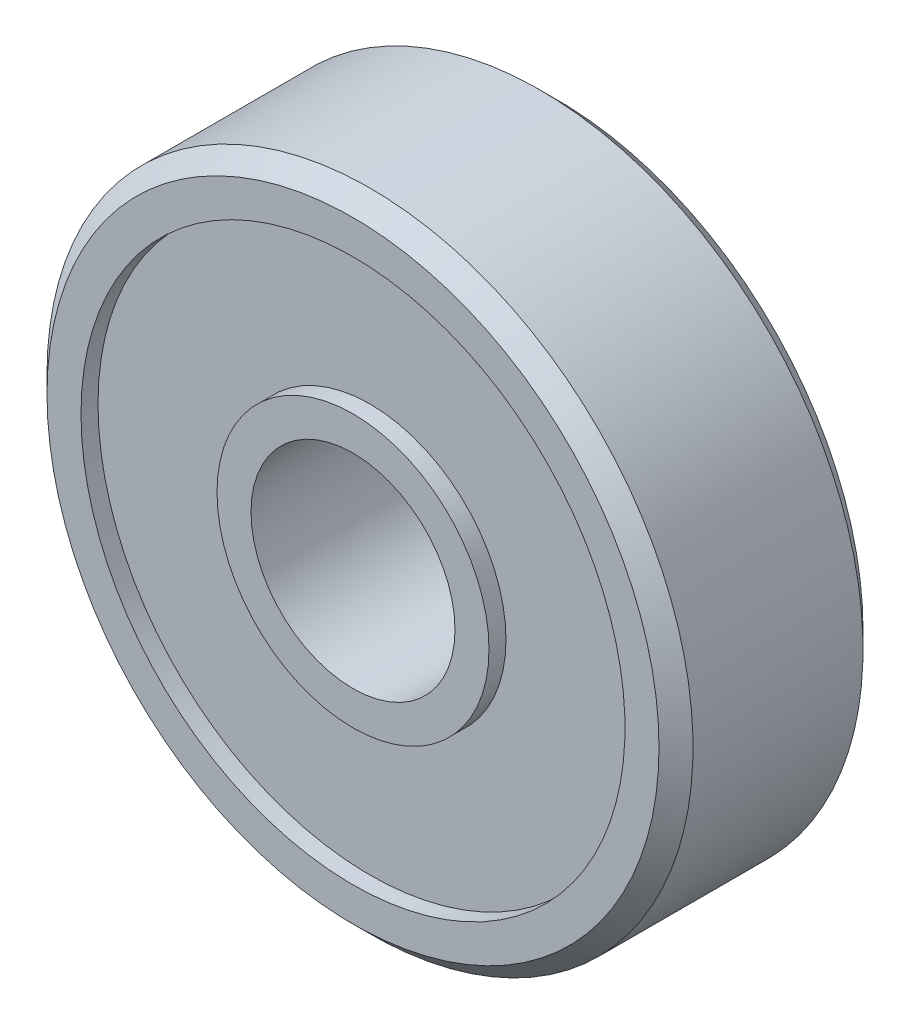
ISO-10303-21;
HEADER;
FILE_DESCRIPTION(('STEP AP214'),'2;1');
FILE_NAME('part.step','',(''),(''),'','','');
FILE_SCHEMA(('AUTOMOTIVE_DESIGN { 1 0 10303 214 1 1 1 1 }'));
ENDSEC;
DATA;
#1=APPLICATION_CONTEXT('core data for automotive mechanical design processes');
#2=APPLICATION_PROTOCOL_DEFINITION('international standard','automotive_design',2000,#1);
#3=PRODUCT_CONTEXT('',#1,'mechanical');
#4=PRODUCT('Part','Part','',(#3));
#5=PRODUCT_RELATED_PRODUCT_CATEGORY('part','',(#4));
#6=PRODUCT_DEFINITION_FORMATION('','',#4);
#7=PRODUCT_DEFINITION_CONTEXT('part definition',#1,'design');
#8=PRODUCT_DEFINITION('design','',#6,#7);
#9=PRODUCT_DEFINITION_SHAPE('','',#8);
#10=(LENGTH_UNIT() NAMED_UNIT(*) SI_UNIT(.MILLI.,.METRE.));
#11=(NAMED_UNIT(*) PLANE_ANGLE_UNIT() SI_UNIT($,.RADIAN.));
#12=(NAMED_UNIT(*) SI_UNIT($,.STERADIAN.) SOLID_ANGLE_UNIT());
#13=UNCERTAINTY_MEASURE_WITH_UNIT(LENGTH_MEASURE(1.E-05),#10,'distance_accuracy_value','');
#14=(GEOMETRIC_REPRESENTATION_CONTEXT(3) GLOBAL_UNCERTAINTY_ASSIGNED_CONTEXT((#13)) GLOBAL_UNIT_ASSIGNED_CONTEXT((#10,
#11,#12)) REPRESENTATION_CONTEXT('',''));
#15=CARTESIAN_POINT('',(0.,0.,0.));
#16=DIRECTION('',(0.,0.,1.));
#17=DIRECTION('',(1.,0.,0.));
#18=AXIS2_PLACEMENT_3D('',#15,#16,#17);
#19=CARTESIAN_POINT('',(0.,0.,0.500000000000005));
#20=DIRECTION('',(0.,0.,-1.));
#21=DIRECTION('',(-1.,0.,0.));
#22=AXIS2_PLACEMENT_3D('',#19,#20,#21);
#23=CYLINDRICAL_SURFACE('',#22,9.5);
#24=CARTESIAN_POINT('',(0.,0.,1.));
#25=DIRECTION('',(0.,0.,-1.));
#26=DIRECTION('',(-1.,0.,0.));
#27=AXIS2_PLACEMENT_3D('',#24,#25,#26);
#28=CIRCLE('',#27,9.5);
#29=CARTESIAN_POINT('',(-9.5,0.,0.999999999999997));
#30=VERTEX_POINT('',#29);
#31=EDGE_CURVE('E10',#30,#30,#28,.T.);
#32=ORIENTED_EDGE('',*,*,#31,.T.);
#33=EDGE_LOOP('',(#32));
#34=FACE_BOUND('',#33,.T.);
#35=CARTESIAN_POINT('',(0.,0.,-4.));
#36=DIRECTION('',(0.,0.,-1.));
#37=DIRECTION('',(-1.,0.,0.));
#38=AXIS2_PLACEMENT_3D('',#35,#36,#37);
#39=CIRCLE('',#38,9.5);
#40=CARTESIAN_POINT('',(-9.49999999999999,0.,-4.));
#41=VERTEX_POINT('',#40);
#42=EDGE_CURVE('E76',#41,#41,#39,.T.);
#43=ORIENTED_EDGE('',*,*,#42,.F.);
#44=EDGE_LOOP('',(#43));
#45=FACE_BOUND('',#44,.T.);
#46=ADVANCED_FACE('F30',(#34,#45),#23,.T.);
#47=CARTESIAN_POINT('',(0.,0.,1.));
#48=DIRECTION('',(0.,0.,-1.));
#49=DIRECTION('',(-1.,0.,0.));
#50=AXIS2_PLACEMENT_3D('',#47,#48,#49);
#51=CONICAL_SURFACE('',#50,9.5,0.785398163397458);
#52=CARTESIAN_POINT('',(0.,0.,1.5));
#53=DIRECTION('',(0.,0.,-1.));
#54=DIRECTION('',(-1.,0.,0.));
#55=AXIS2_PLACEMENT_3D('',#52,#53,#54);
#56=CIRCLE('',#55,8.99999999999999);
#57=CARTESIAN_POINT('',(-8.99999999999999,0.,1.5));
#58=VERTEX_POINT('',#57);
#59=EDGE_CURVE('E36',#58,#58,#56,.T.);
#60=ORIENTED_EDGE('',*,*,#59,.T.);
#61=EDGE_LOOP('',(#60));
#62=FACE_BOUND('',#61,.T.);
#63=ORIENTED_EDGE('',*,*,#31,.F.);
#64=EDGE_LOOP('',(#63));
#65=FACE_BOUND('',#64,.T.);
#66=ADVANCED_FACE('F84',(#62,#65),#51,.T.);
#67=CARTESIAN_POINT('',(8.99999999999999,0.,1.5));
#68=DIRECTION('',(0.,0.,1.));
#69=DIRECTION('',(1.,0.,0.));
#70=AXIS2_PLACEMENT_3D('',#67,#68,#69);
#71=PLANE('',#70);
#72=CARTESIAN_POINT('',(0.,0.,1.5));
#73=DIRECTION('',(0.,0.,-1.));
#74=DIRECTION('',(-1.,0.,0.));
#75=AXIS2_PLACEMENT_3D('',#72,#73,#74);
#76=CIRCLE('',#75,8.);
#77=CARTESIAN_POINT('',(-8.,0.,1.5));
#78=VERTEX_POINT('',#77);
#79=EDGE_CURVE('E40',#78,#78,#76,.T.);
#80=ORIENTED_EDGE('',*,*,#79,.T.);
#81=EDGE_LOOP('',(#80));
#82=FACE_BOUND('',#81,.T.);
#83=ORIENTED_EDGE('',*,*,#59,.F.);
#84=EDGE_LOOP('',(#83));
#85=FACE_BOUND('',#84,.T.);
#86=ADVANCED_FACE('F88',(#82,#85),#71,.T.);
#87=CARTESIAN_POINT('',(0.,0.,0.500000000000005));
#88=DIRECTION('',(0.,0.,-1.));
#89=DIRECTION('',(-1.,0.,0.));
#90=AXIS2_PLACEMENT_3D('',#87,#88,#89);
#91=CYLINDRICAL_SURFACE('',#90,8.);
#92=CARTESIAN_POINT('',(0.,0.,0.999999999999999));
#93=DIRECTION('',(0.,0.,-1.));
#94=DIRECTION('',(-1.,0.,0.));
#95=AXIS2_PLACEMENT_3D('',#92,#93,#94);
#96=CIRCLE('',#95,8.);
#97=CARTESIAN_POINT('',(-8.,0.,0.999999999999997));
#98=VERTEX_POINT('',#97);
#99=EDGE_CURVE('E44',#98,#98,#96,.T.);
#100=ORIENTED_EDGE('',*,*,#99,.T.);
#101=EDGE_LOOP('',(#100));
#102=FACE_BOUND('',#101,.T.);
#103=ORIENTED_EDGE('',*,*,#79,.F.);
#104=EDGE_LOOP('',(#103));
#105=FACE_BOUND('',#104,.T.);
#106=ADVANCED_FACE('F92',(#102,#105),#91,.F.);
#107=CARTESIAN_POINT('',(8.,0.,1.));
#108=DIRECTION('',(0.,0.,1.));
#109=DIRECTION('',(1.,0.,0.));
#110=AXIS2_PLACEMENT_3D('',#107,#108,#109);
#111=PLANE('',#110);
#112=CARTESIAN_POINT('',(0.,0.,1.));
#113=DIRECTION('',(0.,0.,-1.));
#114=DIRECTION('',(-1.,0.,0.));
#115=AXIS2_PLACEMENT_3D('',#112,#113,#114);
#116=CIRCLE('',#115,4.);
#117=CARTESIAN_POINT('',(-4.,0.,0.999999999999999));
#118=VERTEX_POINT('',#117);
#119=EDGE_CURVE('E49',#118,#118,#116,.T.);
#120=ORIENTED_EDGE('',*,*,#119,.T.);
#121=EDGE_LOOP('',(#120));
#122=FACE_BOUND('',#121,.T.);
#123=ORIENTED_EDGE('',*,*,#99,.F.);
#124=EDGE_LOOP('',(#123));
#125=FACE_BOUND('',#124,.T.);
#126=ADVANCED_FACE('F99',(#122,#125),#111,.T.);
#127=CARTESIAN_POINT('',(0.,0.,0.500000000000005));
#128=DIRECTION('',(0.,0.,-1.));
#129=DIRECTION('',(-1.,0.,0.));
#130=AXIS2_PLACEMENT_3D('',#127,#128,#129);
#131=CYLINDRICAL_SURFACE('',#130,4.);
#132=CARTESIAN_POINT('',(0.,0.,1.5));
#133=DIRECTION('',(0.,0.,-1.));
#134=DIRECTION('',(-1.,0.,0.));
#135=AXIS2_PLACEMENT_3D('',#132,#133,#134);
#136=CIRCLE('',#135,4.);
#137=CARTESIAN_POINT('',(-4.,0.,1.5));
#138=VERTEX_POINT('',#137);
#139=EDGE_CURVE('E52',#138,#138,#136,.T.);
#140=ORIENTED_EDGE('',*,*,#139,.T.);
#141=EDGE_LOOP('',(#140));
#142=FACE_BOUND('',#141,.T.);
#143=ORIENTED_EDGE('',*,*,#119,.F.);
#144=EDGE_LOOP('',(#143));
#145=FACE_BOUND('',#144,.T.);
#146=ADVANCED_FACE('F103',(#142,#145),#131,.T.);
#147=CARTESIAN_POINT('',(4.,0.,1.5));
#148=DIRECTION('',(0.,0.,1.));
#149=DIRECTION('',(1.,0.,0.));
#150=AXIS2_PLACEMENT_3D('',#147,#148,#149);
#151=PLANE('',#150);
#152=CARTESIAN_POINT('',(0.,0.,1.5));
#153=DIRECTION('',(0.,0.,-1.));
#154=DIRECTION('',(-1.,0.,0.));
#155=AXIS2_PLACEMENT_3D('',#152,#153,#154);
#156=CIRCLE('',#155,3.);
#157=CARTESIAN_POINT('',(-3.,0.,1.5));
#158=VERTEX_POINT('',#157);
#159=EDGE_CURVE('E55',#158,#158,#156,.T.);
#160=ORIENTED_EDGE('',*,*,#159,.T.);
#161=EDGE_LOOP('',(#160));
#162=FACE_BOUND('',#161,.T.);
#163=ORIENTED_EDGE('',*,*,#139,.F.);
#164=EDGE_LOOP('',(#163));
#165=FACE_BOUND('',#164,.T.);
#166=ADVANCED_FACE('F107',(#162,#165),#151,.T.);
#167=CARTESIAN_POINT('',(0.,0.,0.500000000000005));
#168=DIRECTION('',(0.,0.,-1.));
#169=DIRECTION('',(-1.,0.,0.));
#170=AXIS2_PLACEMENT_3D('',#167,#168,#169);
#171=CYLINDRICAL_SURFACE('',#170,3.);
#172=CARTESIAN_POINT('',(0.,0.,-4.5));
#173=DIRECTION('',(0.,0.,-1.));
#174=DIRECTION('',(-1.,0.,0.));
#175=AXIS2_PLACEMENT_3D('',#172,#173,#174);
#176=CIRCLE('',#175,3.);
#177=CARTESIAN_POINT('',(-2.99999999999999,0.,-4.5));
#178=VERTEX_POINT('',#177);
#179=EDGE_CURVE('E58',#178,#178,#176,.T.);
#180=ORIENTED_EDGE('',*,*,#179,.T.);
#181=EDGE_LOOP('',(#180));
#182=FACE_BOUND('',#181,.T.);
#183=ORIENTED_EDGE('',*,*,#159,.F.);
#184=EDGE_LOOP('',(#183));
#185=FACE_BOUND('',#184,.T.);
#186=ADVANCED_FACE('F111',(#182,#185),#171,.F.);
#187=CARTESIAN_POINT('',(3.,0.,-4.5));
#188=DIRECTION('',(0.,0.,-1.));
#189=DIRECTION('',(-1.,0.,0.));
#190=AXIS2_PLACEMENT_3D('',#187,#188,#189);
#191=PLANE('',#190);
#192=CARTESIAN_POINT('',(0.,0.,-4.5));
#193=DIRECTION('',(0.,0.,-1.));
#194=DIRECTION('',(-1.,0.,0.));
#195=AXIS2_PLACEMENT_3D('',#192,#193,#194);
#196=CIRCLE('',#195,4.);
#197=CARTESIAN_POINT('',(-3.99999999999999,0.,-4.5));
#198=VERTEX_POINT('',#197);
#199=EDGE_CURVE('E61',#198,#198,#196,.T.);
#200=ORIENTED_EDGE('',*,*,#199,.T.);
#201=EDGE_LOOP('',(#200));
#202=FACE_BOUND('',#201,.T.);
#203=ORIENTED_EDGE('',*,*,#179,.F.);
#204=EDGE_LOOP('',(#203));
#205=FACE_BOUND('',#204,.T.);
#206=ADVANCED_FACE('F115',(#202,#205),#191,.T.);
#207=CARTESIAN_POINT('',(0.,0.,0.500000000000005));
#208=DIRECTION('',(0.,0.,-1.));
#209=DIRECTION('',(-1.,0.,0.));
#210=AXIS2_PLACEMENT_3D('',#207,#208,#209);
#211=CYLINDRICAL_SURFACE('',#210,4.);
#212=CARTESIAN_POINT('',(0.,0.,-4.));
#213=DIRECTION('',(0.,0.,-1.));
#214=DIRECTION('',(-1.,0.,0.));
#215=AXIS2_PLACEMENT_3D('',#212,#213,#214);
#216=CIRCLE('',#215,4.);
#217=CARTESIAN_POINT('',(-3.99999999999999,0.,-4.));
#218=VERTEX_POINT('',#217);
#219=EDGE_CURVE('E64',#218,#218,#216,.T.);
#220=ORIENTED_EDGE('',*,*,#219,.T.);
#221=EDGE_LOOP('',(#220));
#222=FACE_BOUND('',#221,.T.);
#223=ORIENTED_EDGE('',*,*,#199,.F.);
#224=EDGE_LOOP('',(#223));
#225=FACE_BOUND('',#224,.T.);
#226=ADVANCED_FACE('F119',(#222,#225),#211,.T.);
#227=CARTESIAN_POINT('',(4.,0.,-4.));
#228=DIRECTION('',(0.,0.,-1.));
#229=DIRECTION('',(-1.,0.,0.));
#230=AXIS2_PLACEMENT_3D('',#227,#228,#229);
#231=PLANE('',#230);
#232=CARTESIAN_POINT('',(0.,0.,-4.));
#233=DIRECTION('',(0.,0.,-1.));
#234=DIRECTION('',(-1.,0.,0.));
#235=AXIS2_PLACEMENT_3D('',#232,#233,#234);
#236=CIRCLE('',#235,8.);
#237=CARTESIAN_POINT('',(-8.,0.,-4.));
#238=VERTEX_POINT('',#237);
#239=EDGE_CURVE('E67',#238,#238,#236,.T.);
#240=ORIENTED_EDGE('',*,*,#239,.T.);
#241=EDGE_LOOP('',(#240));
#242=FACE_BOUND('',#241,.T.);
#243=ORIENTED_EDGE('',*,*,#219,.F.);
#244=EDGE_LOOP('',(#243));
#245=FACE_BOUND('',#244,.T.);
#246=ADVANCED_FACE('F123',(#242,#245),#231,.T.);
#247=CARTESIAN_POINT('',(0.,0.,0.500000000000005));
#248=DIRECTION('',(0.,0.,-1.));
#249=DIRECTION('',(-1.,0.,0.));
#250=AXIS2_PLACEMENT_3D('',#247,#248,#249);
#251=CYLINDRICAL_SURFACE('',#250,8.);
#252=CARTESIAN_POINT('',(0.,0.,-4.5));
#253=DIRECTION('',(0.,0.,-1.));
#254=DIRECTION('',(-1.,0.,0.));
#255=AXIS2_PLACEMENT_3D('',#252,#253,#254);
#256=CIRCLE('',#255,8.);
#257=CARTESIAN_POINT('',(-8.,0.,-4.5));
#258=VERTEX_POINT('',#257);
#259=EDGE_CURVE('E70',#258,#258,#256,.T.);
#260=ORIENTED_EDGE('',*,*,#259,.T.);
#261=EDGE_LOOP('',(#260));
#262=FACE_BOUND('',#261,.T.);
#263=ORIENTED_EDGE('',*,*,#239,.F.);
#264=EDGE_LOOP('',(#263));
#265=FACE_BOUND('',#264,.T.);
#266=ADVANCED_FACE('F127',(#262,#265),#251,.F.);
#267=CARTESIAN_POINT('',(8.,0.,-4.5));
#268=DIRECTION('',(0.,0.,-1.));
#269=DIRECTION('',(-1.,0.,0.));
#270=AXIS2_PLACEMENT_3D('',#267,#268,#269);
#271=PLANE('',#270);
#272=CARTESIAN_POINT('',(0.,0.,-4.5));
#273=DIRECTION('',(0.,0.,-1.));
#274=DIRECTION('',(-1.,0.,0.));
#275=AXIS2_PLACEMENT_3D('',#272,#273,#274);
#276=CIRCLE('',#275,8.99999999999999);
#277=CARTESIAN_POINT('',(-8.99999999999999,0.,-4.50000000000001));
#278=VERTEX_POINT('',#277);
#279=EDGE_CURVE('E73',#278,#278,#276,.T.);
#280=ORIENTED_EDGE('',*,*,#279,.T.);
#281=EDGE_LOOP('',(#280));
#282=FACE_BOUND('',#281,.T.);
#283=ORIENTED_EDGE('',*,*,#259,.F.);
#284=EDGE_LOOP('',(#283));
#285=FACE_BOUND('',#284,.T.);
#286=ADVANCED_FACE('F131',(#282,#285),#271,.T.);
#287=CARTESIAN_POINT('',(0.,0.,-4.5));
#288=DIRECTION('',(0.,0.,1.));
#289=DIRECTION('',(1.,0.,0.));
#290=AXIS2_PLACEMENT_3D('',#287,#288,#289);
#291=CONICAL_SURFACE('',#290,8.99999999999999,0.785398163397453);
#292=ORIENTED_EDGE('',*,*,#42,.T.);
#293=EDGE_LOOP('',(#292));
#294=FACE_BOUND('',#293,.T.);
#295=ORIENTED_EDGE('',*,*,#279,.F.);
#296=EDGE_LOOP('',(#295));
#297=FACE_BOUND('',#296,.T.);
#298=ADVANCED_FACE('F80',(#294,#297),#291,.T.);
#299=CLOSED_SHELL('',(#46,#66,#86,#106,#126,#146,#166,#186,#206,#226,#246,#266,#286,#298));
#300=MANIFOLD_SOLID_BREP('B2',#299);
#301=ADVANCED_BREP_SHAPE_REPRESENTATION('',(#18,#300),#14);
#302=SHAPE_DEFINITION_REPRESENTATION(#9,#301);
ENDSEC;
END-ISO-10303-21;
